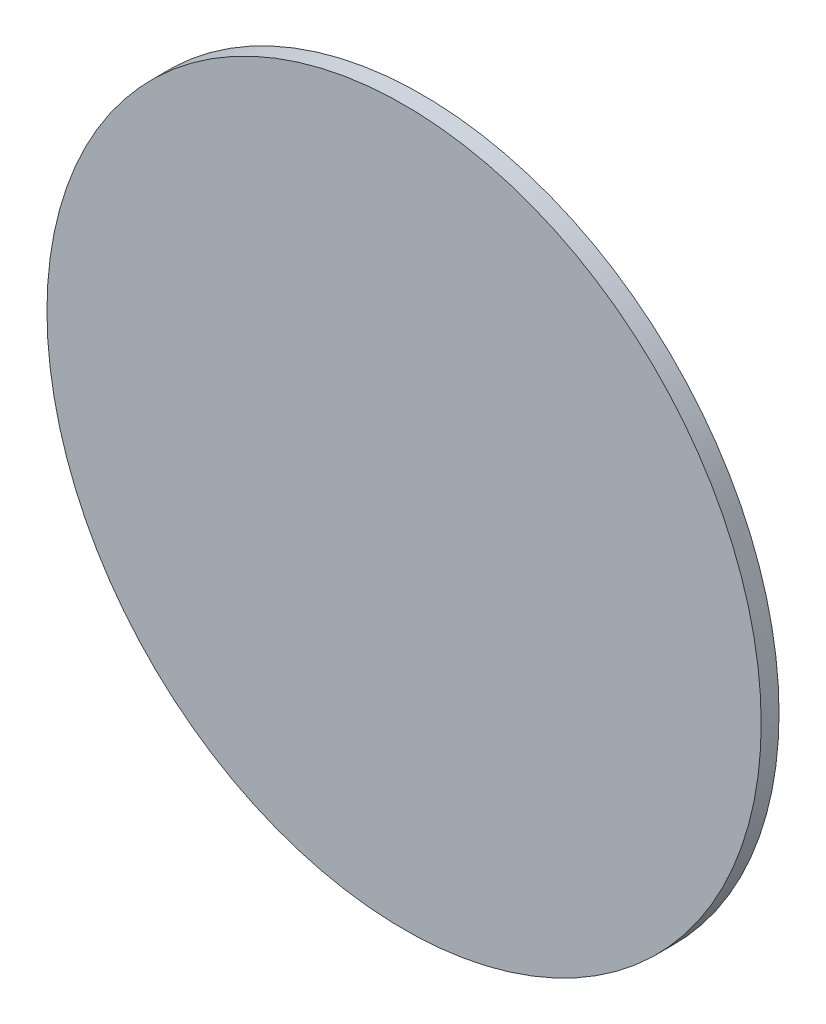
ISO-10303-21;
HEADER;
FILE_DESCRIPTION(('STEP AP214'),'2;1');
FILE_NAME('part.step','',(''),(''),'','','');
FILE_SCHEMA(('AUTOMOTIVE_DESIGN { 1 0 10303 214 1 1 1 1 }'));
ENDSEC;
DATA;
#1=APPLICATION_CONTEXT('core data for automotive mechanical design processes');
#2=APPLICATION_PROTOCOL_DEFINITION('international standard','automotive_design',2000,#1);
#3=PRODUCT_CONTEXT('',#1,'mechanical');
#4=PRODUCT('Part','Part','',(#3));
#5=PRODUCT_RELATED_PRODUCT_CATEGORY('part','',(#4));
#6=PRODUCT_DEFINITION_FORMATION('','',#4);
#7=PRODUCT_DEFINITION_CONTEXT('part definition',#1,'design');
#8=PRODUCT_DEFINITION('design','',#6,#7);
#9=PRODUCT_DEFINITION_SHAPE('','',#8);
#10=(LENGTH_UNIT() NAMED_UNIT(*) SI_UNIT(.MILLI.,.METRE.));
#11=(NAMED_UNIT(*) PLANE_ANGLE_UNIT() SI_UNIT($,.RADIAN.));
#12=(NAMED_UNIT(*) SI_UNIT($,.STERADIAN.) SOLID_ANGLE_UNIT());
#13=UNCERTAINTY_MEASURE_WITH_UNIT(LENGTH_MEASURE(1.E-05),#10,'distance_accuracy_value','');
#14=(GEOMETRIC_REPRESENTATION_CONTEXT(3) GLOBAL_UNCERTAINTY_ASSIGNED_CONTEXT((#13)) GLOBAL_UNIT_ASSIGNED_CONTEXT((#10,
#11,#12)) REPRESENTATION_CONTEXT('',''));
#15=CARTESIAN_POINT('',(0.,0.,0.));
#16=DIRECTION('',(0.,0.,1.));
#17=DIRECTION('',(1.,0.,0.));
#18=AXIS2_PLACEMENT_3D('',#15,#16,#17);
#19=CARTESIAN_POINT('',(0.,0.,2.54));
#20=DIRECTION('',(0.,0.,-1.));
#21=DIRECTION('',(-1.,0.,0.));
#22=AXIS2_PLACEMENT_3D('',#19,#20,#21);
#23=CYLINDRICAL_SURFACE('',#22,50.8);
#24=CARTESIAN_POINT('',(0.,0.,2.54));
#25=DIRECTION('',(0.,0.,1.));
#26=DIRECTION('',(1.,0.,0.));
#27=AXIS2_PLACEMENT_3D('',#24,#25,#26);
#28=CIRCLE('',#27,50.8);
#29=CARTESIAN_POINT('',(50.8,0.,2.54));
#30=VERTEX_POINT('',#29);
#31=EDGE_CURVE('E10',#30,#30,#28,.T.);
#32=ORIENTED_EDGE('',*,*,#31,.F.);
#33=EDGE_LOOP('',(#32));
#34=FACE_BOUND('',#33,.T.);
#35=CARTESIAN_POINT('',(0.,0.,0.));
#36=DIRECTION('',(0.,0.,1.));
#37=DIRECTION('',(1.,0.,0.));
#38=AXIS2_PLACEMENT_3D('',#35,#36,#37);
#39=CIRCLE('',#38,50.8);
#40=CARTESIAN_POINT('',(50.8,0.,0.));
#41=VERTEX_POINT('',#40);
#42=EDGE_CURVE('E46',#41,#41,#39,.T.);
#43=ORIENTED_EDGE('',*,*,#42,.T.);
#44=EDGE_LOOP('',(#43));
#45=FACE_BOUND('',#44,.T.);
#46=ADVANCED_FACE('F43',(#34,#45),#23,.T.);
#47=CARTESIAN_POINT('',(0.,0.,2.54));
#48=DIRECTION('',(0.,0.,1.));
#49=DIRECTION('',(1.,0.,0.));
#50=AXIS2_PLACEMENT_3D('',#47,#48,#49);
#51=PLANE('',#50);
#52=ORIENTED_EDGE('',*,*,#31,.T.);
#53=EDGE_LOOP('',(#52));
#54=FACE_BOUND('',#53,.T.);
#55=ADVANCED_FACE('F60',(#54),#51,.T.);
#56=CARTESIAN_POINT('',(0.,0.,0.));
#57=DIRECTION('',(0.,0.,1.));
#58=DIRECTION('',(1.,0.,0.));
#59=AXIS2_PLACEMENT_3D('',#56,#57,#58);
#60=PLANE('',#59);
#61=ORIENTED_EDGE('',*,*,#42,.F.);
#62=EDGE_LOOP('',(#61));
#63=FACE_BOUND('',#62,.T.);
#64=ADVANCED_FACE('F58',(#63),#60,.F.);
#65=CLOSED_SHELL('',(#46,#55,#64));
#66=MANIFOLD_SOLID_BREP('B2',#65);
#67=ADVANCED_BREP_SHAPE_REPRESENTATION('',(#18,#66),#14);
#68=SHAPE_DEFINITION_REPRESENTATION(#9,#67);
ENDSEC;
END-ISO-10303-21;
